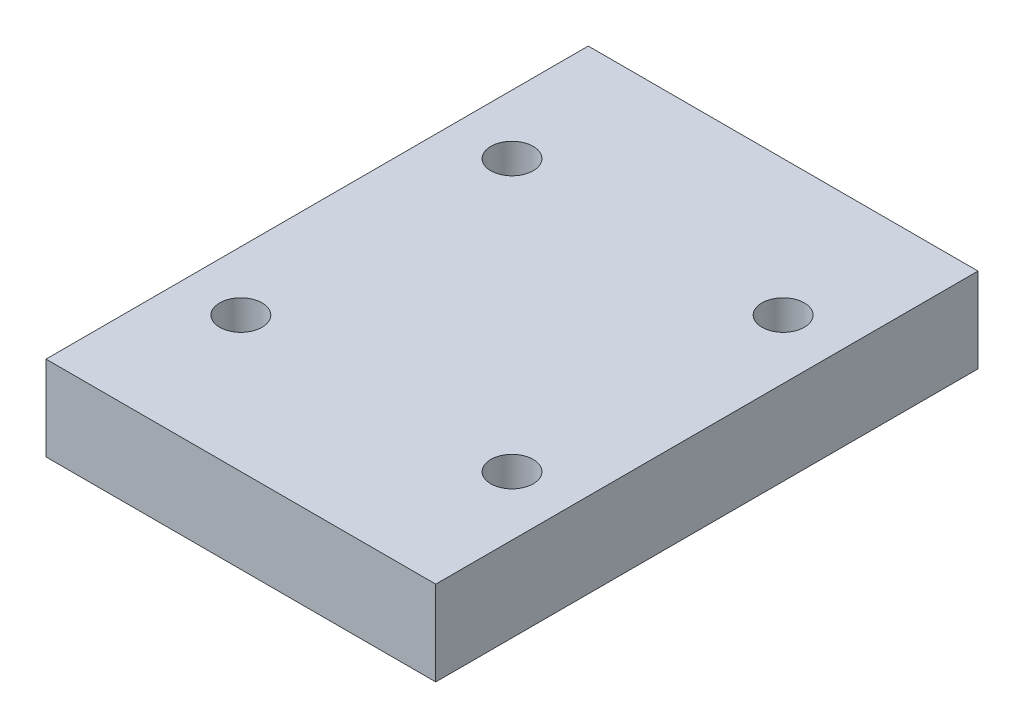
ISO-10303-21;
HEADER;
FILE_DESCRIPTION(('STEP AP214'),'2;1');
FILE_NAME('part.step','',(''),(''),'','','');
FILE_SCHEMA(('AUTOMOTIVE_DESIGN { 1 0 10303 214 1 1 1 1 }'));
ENDSEC;
DATA;
#1=APPLICATION_CONTEXT('core data for automotive mechanical design processes');
#2=APPLICATION_PROTOCOL_DEFINITION('international standard','automotive_design',2000,#1);
#3=PRODUCT_CONTEXT('',#1,'mechanical');
#4=PRODUCT('Part','Part','',(#3));
#5=PRODUCT_RELATED_PRODUCT_CATEGORY('part','',(#4));
#6=PRODUCT_DEFINITION_FORMATION('','',#4);
#7=PRODUCT_DEFINITION_CONTEXT('part definition',#1,'design');
#8=PRODUCT_DEFINITION('design','',#6,#7);
#9=PRODUCT_DEFINITION_SHAPE('','',#8);
#10=(LENGTH_UNIT() NAMED_UNIT(*) SI_UNIT(.MILLI.,.METRE.));
#11=(NAMED_UNIT(*) PLANE_ANGLE_UNIT() SI_UNIT($,.RADIAN.));
#12=(NAMED_UNIT(*) SI_UNIT($,.STERADIAN.) SOLID_ANGLE_UNIT());
#13=UNCERTAINTY_MEASURE_WITH_UNIT(LENGTH_MEASURE(1.E-05),#10,'distance_accuracy_value','');
#14=(GEOMETRIC_REPRESENTATION_CONTEXT(3) GLOBAL_UNCERTAINTY_ASSIGNED_CONTEXT((#13)) GLOBAL_UNIT_ASSIGNED_CONTEXT((#10,
#11,#12)) REPRESENTATION_CONTEXT('',''));
#15=CARTESIAN_POINT('',(0.,0.,0.));
#16=DIRECTION('',(0.,0.,1.));
#17=DIRECTION('',(1.,0.,0.));
#18=AXIS2_PLACEMENT_3D('',#15,#16,#17);
#19=CARTESIAN_POINT('',(0.,5.,0.));
#20=DIRECTION('',(0.,-1.,0.));
#21=DIRECTION('',(0.,0.,-1.));
#22=AXIS2_PLACEMENT_3D('',#19,#20,#21);
#23=PLANE('',#22);
#24=DIRECTION('',(0.,0.,1.));
#25=VECTOR('',#24,1.);
#26=CARTESIAN_POINT('',(-11.5,5.,-16.));
#27=LINE('',#26,#25);
#28=CARTESIAN_POINT('',(-11.5,5.,-16.));
#29=VERTEX_POINT('',#28);
#30=CARTESIAN_POINT('',(-11.5,5.,16.));
#31=VERTEX_POINT('',#30);
#32=EDGE_CURVE('E88',#29,#31,#27,.T.);
#33=ORIENTED_EDGE('',*,*,#32,.T.);
#34=DIRECTION('',(1.,0.,0.));
#35=VECTOR('',#34,1.);
#36=CARTESIAN_POINT('',(11.5,5.,16.));
#37=LINE('',#36,#35);
#38=CARTESIAN_POINT('',(11.5,5.,16.));
#39=VERTEX_POINT('',#38);
#40=EDGE_CURVE('E83',#31,#39,#37,.T.);
#41=ORIENTED_EDGE('',*,*,#40,.T.);
#42=DIRECTION('',(0.,0.,-1.));
#43=VECTOR('',#42,1.);
#44=CARTESIAN_POINT('',(11.5,5.,-16.));
#45=LINE('',#44,#43);
#46=CARTESIAN_POINT('',(11.5,5.,-16.));
#47=VERTEX_POINT('',#46);
#48=EDGE_CURVE('E86',#39,#47,#45,.T.);
#49=ORIENTED_EDGE('',*,*,#48,.T.);
#50=DIRECTION('',(-1.,0.,0.));
#51=VECTOR('',#50,1.);
#52=CARTESIAN_POINT('',(11.5,5.,-16.));
#53=LINE('',#52,#51);
#54=EDGE_CURVE('E53',#47,#29,#53,.T.);
#55=ORIENTED_EDGE('',*,*,#54,.T.);
#56=EDGE_LOOP('',(#33,#41,#49,#55));
#57=FACE_BOUND('',#56,.T.);
#58=CARTESIAN_POINT('',(-8.,5.,8.));
#59=DIRECTION('',(0.,1.,0.));
#60=DIRECTION('',(0.,0.,1.));
#61=AXIS2_PLACEMENT_3D('',#58,#59,#60);
#62=CIRCLE('',#61,1.25);
#63=CARTESIAN_POINT('',(-8.,5.,9.25));
#64=VERTEX_POINT('',#63);
#65=EDGE_CURVE('E103',#64,#64,#62,.T.);
#66=ORIENTED_EDGE('',*,*,#65,.F.);
#67=EDGE_LOOP('',(#66));
#68=FACE_BOUND('',#67,.T.);
#69=CARTESIAN_POINT('',(-8.,5.,-8.));
#70=DIRECTION('',(0.,1.,0.));
#71=DIRECTION('',(0.,0.,-1.));
#72=AXIS2_PLACEMENT_3D('',#69,#70,#71);
#73=CIRCLE('',#72,1.25);
#74=CARTESIAN_POINT('',(-8.,5.,-9.25));
#75=VERTEX_POINT('',#74);
#76=EDGE_CURVE('E118',#75,#75,#73,.T.);
#77=ORIENTED_EDGE('',*,*,#76,.F.);
#78=EDGE_LOOP('',(#77));
#79=FACE_BOUND('',#78,.T.);
#80=CARTESIAN_POINT('',(7.99999999999999,5.,-8.));
#81=DIRECTION('',(0.,1.,0.));
#82=DIRECTION('',(0.,0.,1.));
#83=AXIS2_PLACEMENT_3D('',#80,#81,#82);
#84=CIRCLE('',#83,1.25);
#85=CARTESIAN_POINT('',(7.99999999999999,5.,-6.75));
#86=VERTEX_POINT('',#85);
#87=EDGE_CURVE('E124',#86,#86,#84,.T.);
#88=ORIENTED_EDGE('',*,*,#87,.F.);
#89=EDGE_LOOP('',(#88));
#90=FACE_BOUND('',#89,.T.);
#91=CARTESIAN_POINT('',(8.,5.,8.));
#92=DIRECTION('',(0.,1.,0.));
#93=DIRECTION('',(0.,0.,-1.));
#94=AXIS2_PLACEMENT_3D('',#91,#92,#93);
#95=CIRCLE('',#94,1.25);
#96=CARTESIAN_POINT('',(8.,5.,6.75));
#97=VERTEX_POINT('',#96);
#98=EDGE_CURVE('E130',#97,#97,#95,.T.);
#99=ORIENTED_EDGE('',*,*,#98,.F.);
#100=EDGE_LOOP('',(#99));
#101=FACE_BOUND('',#100,.T.);
#102=ADVANCED_FACE('F36',(#57,#68,#79,#90,#101),#23,.F.);
#103=CARTESIAN_POINT('',(0.,0.,0.));
#104=DIRECTION('',(0.,-1.,0.));
#105=DIRECTION('',(0.,0.,-1.));
#106=AXIS2_PLACEMENT_3D('',#103,#104,#105);
#107=PLANE('',#106);
#108=CARTESIAN_POINT('',(7.99999999999999,0.,-8.));
#109=DIRECTION('',(0.,1.,0.));
#110=DIRECTION('',(0.,0.,1.));
#111=AXIS2_PLACEMENT_3D('',#108,#109,#110);
#112=CIRCLE('',#111,1.25);
#113=CARTESIAN_POINT('',(7.99999999999999,0.,-6.75));
#114=VERTEX_POINT('',#113);
#115=EDGE_CURVE('E127',#114,#114,#112,.T.);
#116=ORIENTED_EDGE('',*,*,#115,.T.);
#117=EDGE_LOOP('',(#116));
#118=FACE_BOUND('',#117,.T.);
#119=CARTESIAN_POINT('',(-8.,0.,8.));
#120=DIRECTION('',(0.,1.,0.));
#121=DIRECTION('',(0.,0.,1.));
#122=AXIS2_PLACEMENT_3D('',#119,#120,#121);
#123=CIRCLE('',#122,1.25);
#124=CARTESIAN_POINT('',(-8.,0.,9.25));
#125=VERTEX_POINT('',#124);
#126=EDGE_CURVE('E115',#125,#125,#123,.T.);
#127=ORIENTED_EDGE('',*,*,#126,.T.);
#128=EDGE_LOOP('',(#127));
#129=FACE_BOUND('',#128,.T.);
#130=DIRECTION('',(0.,0.,1.));
#131=VECTOR('',#130,1.);
#132=CARTESIAN_POINT('',(-11.5,0.,-16.));
#133=LINE('',#132,#131);
#134=CARTESIAN_POINT('',(-11.5,0.,-16.));
#135=VERTEX_POINT('',#134);
#136=CARTESIAN_POINT('',(-11.5,0.,16.));
#137=VERTEX_POINT('',#136);
#138=EDGE_CURVE('E100',#135,#137,#133,.T.);
#139=ORIENTED_EDGE('',*,*,#138,.F.);
#140=DIRECTION('',(-1.,0.,0.));
#141=VECTOR('',#140,1.);
#142=CARTESIAN_POINT('',(11.5,0.,-16.));
#143=LINE('',#142,#141);
#144=CARTESIAN_POINT('',(11.5,0.,-16.));
#145=VERTEX_POINT('',#144);
#146=EDGE_CURVE('E76',#145,#135,#143,.T.);
#147=ORIENTED_EDGE('',*,*,#146,.F.);
#148=DIRECTION('',(0.,0.,-1.));
#149=VECTOR('',#148,1.);
#150=CARTESIAN_POINT('',(11.5,0.,-16.));
#151=LINE('',#150,#149);
#152=CARTESIAN_POINT('',(11.5,0.,16.));
#153=VERTEX_POINT('',#152);
#154=EDGE_CURVE('E70',#153,#145,#151,.T.);
#155=ORIENTED_EDGE('',*,*,#154,.F.);
#156=DIRECTION('',(1.,0.,0.));
#157=VECTOR('',#156,1.);
#158=CARTESIAN_POINT('',(11.5,0.,16.));
#159=LINE('',#158,#157);
#160=EDGE_CURVE('E92',#137,#153,#159,.T.);
#161=ORIENTED_EDGE('',*,*,#160,.F.);
#162=EDGE_LOOP('',(#139,#147,#155,#161));
#163=FACE_BOUND('',#162,.T.);
#164=CARTESIAN_POINT('',(-8.,0.,-8.));
#165=DIRECTION('',(0.,1.,0.));
#166=DIRECTION('',(0.,0.,-1.));
#167=AXIS2_PLACEMENT_3D('',#164,#165,#166);
#168=CIRCLE('',#167,1.25);
#169=CARTESIAN_POINT('',(-8.,0.,-9.25));
#170=VERTEX_POINT('',#169);
#171=EDGE_CURVE('E121',#170,#170,#168,.T.);
#172=ORIENTED_EDGE('',*,*,#171,.T.);
#173=EDGE_LOOP('',(#172));
#174=FACE_BOUND('',#173,.T.);
#175=CARTESIAN_POINT('',(8.,0.,8.));
#176=DIRECTION('',(0.,1.,0.));
#177=DIRECTION('',(0.,0.,-1.));
#178=AXIS2_PLACEMENT_3D('',#175,#176,#177);
#179=CIRCLE('',#178,1.25);
#180=CARTESIAN_POINT('',(8.,0.,6.75));
#181=VERTEX_POINT('',#180);
#182=EDGE_CURVE('E133',#181,#181,#179,.T.);
#183=ORIENTED_EDGE('',*,*,#182,.T.);
#184=EDGE_LOOP('',(#183));
#185=FACE_BOUND('',#184,.T.);
#186=ADVANCED_FACE('F111',(#118,#129,#163,#174,#185),#107,.T.);
#187=CARTESIAN_POINT('',(-11.5,5.,-16.));
#188=DIRECTION('',(1.,0.,0.));
#189=DIRECTION('',(0.,0.,-1.));
#190=AXIS2_PLACEMENT_3D('',#187,#188,#189);
#191=PLANE('',#190);
#192=ORIENTED_EDGE('',*,*,#138,.T.);
#193=DIRECTION('',(0.,-1.,0.));
#194=VECTOR('',#193,1.);
#195=CARTESIAN_POINT('',(-11.5,5.,16.));
#196=LINE('',#195,#194);
#197=EDGE_CURVE('E11',#31,#137,#196,.T.);
#198=ORIENTED_EDGE('',*,*,#197,.F.);
#199=ORIENTED_EDGE('',*,*,#32,.F.);
#200=DIRECTION('',(0.,-1.,0.));
#201=VECTOR('',#200,1.);
#202=CARTESIAN_POINT('',(-11.5,5.,-16.));
#203=LINE('',#202,#201);
#204=EDGE_CURVE('E96',#29,#135,#203,.T.);
#205=ORIENTED_EDGE('',*,*,#204,.T.);
#206=EDGE_LOOP('',(#192,#198,#199,#205));
#207=FACE_BOUND('',#206,.T.);
#208=ADVANCED_FACE('F38',(#207),#191,.F.);
#209=CARTESIAN_POINT('',(11.5,5.,16.));
#210=DIRECTION('',(0.,0.,-1.));
#211=DIRECTION('',(-1.,0.,0.));
#212=AXIS2_PLACEMENT_3D('',#209,#210,#211);
#213=PLANE('',#212);
#214=ORIENTED_EDGE('',*,*,#160,.T.);
#215=DIRECTION('',(0.,-1.,0.));
#216=VECTOR('',#215,1.);
#217=CARTESIAN_POINT('',(11.5,5.,16.));
#218=LINE('',#217,#216);
#219=EDGE_CURVE('E45',#39,#153,#218,.T.);
#220=ORIENTED_EDGE('',*,*,#219,.F.);
#221=ORIENTED_EDGE('',*,*,#40,.F.);
#222=ORIENTED_EDGE('',*,*,#197,.T.);
#223=EDGE_LOOP('',(#214,#220,#221,#222));
#224=FACE_BOUND('',#223,.T.);
#225=ADVANCED_FACE('F91',(#224),#213,.F.);
#226=CARTESIAN_POINT('',(11.5,5.,-16.));
#227=DIRECTION('',(-1.,0.,0.));
#228=DIRECTION('',(0.,0.,1.));
#229=AXIS2_PLACEMENT_3D('',#226,#227,#228);
#230=PLANE('',#229);
#231=ORIENTED_EDGE('',*,*,#154,.T.);
#232=DIRECTION('',(0.,-1.,0.));
#233=VECTOR('',#232,1.);
#234=CARTESIAN_POINT('',(11.5,5.,-16.));
#235=LINE('',#234,#233);
#236=EDGE_CURVE('E93',#47,#145,#235,.T.);
#237=ORIENTED_EDGE('',*,*,#236,.F.);
#238=ORIENTED_EDGE('',*,*,#48,.F.);
#239=ORIENTED_EDGE('',*,*,#219,.T.);
#240=EDGE_LOOP('',(#231,#237,#238,#239));
#241=FACE_BOUND('',#240,.T.);
#242=ADVANCED_FACE('F94',(#241),#230,.F.);
#243=CARTESIAN_POINT('',(11.5,5.,-16.));
#244=DIRECTION('',(0.,0.,1.));
#245=DIRECTION('',(1.,0.,0.));
#246=AXIS2_PLACEMENT_3D('',#243,#244,#245);
#247=PLANE('',#246);
#248=ORIENTED_EDGE('',*,*,#146,.T.);
#249=ORIENTED_EDGE('',*,*,#204,.F.);
#250=ORIENTED_EDGE('',*,*,#54,.F.);
#251=ORIENTED_EDGE('',*,*,#236,.T.);
#252=EDGE_LOOP('',(#248,#249,#250,#251));
#253=FACE_BOUND('',#252,.T.);
#254=ADVANCED_FACE('F108',(#253),#247,.F.);
#255=CARTESIAN_POINT('',(-8.,5.,8.));
#256=DIRECTION('',(0.,-1.,0.));
#257=DIRECTION('',(0.,0.,-1.));
#258=AXIS2_PLACEMENT_3D('',#255,#256,#257);
#259=CYLINDRICAL_SURFACE('',#258,1.25);
#260=ORIENTED_EDGE('',*,*,#65,.T.);
#261=EDGE_LOOP('',(#260));
#262=FACE_BOUND('',#261,.T.);
#263=ORIENTED_EDGE('',*,*,#126,.F.);
#264=EDGE_LOOP('',(#263));
#265=FACE_BOUND('',#264,.T.);
#266=ADVANCED_FACE('F150',(#262,#265),#259,.F.);
#267=CARTESIAN_POINT('',(-8.,5.,-8.));
#268=DIRECTION('',(0.,-1.,0.));
#269=DIRECTION('',(0.,0.,-1.));
#270=AXIS2_PLACEMENT_3D('',#267,#268,#269);
#271=CYLINDRICAL_SURFACE('',#270,1.25);
#272=ORIENTED_EDGE('',*,*,#76,.T.);
#273=EDGE_LOOP('',(#272));
#274=FACE_BOUND('',#273,.T.);
#275=ORIENTED_EDGE('',*,*,#171,.F.);
#276=EDGE_LOOP('',(#275));
#277=FACE_BOUND('',#276,.T.);
#278=ADVANCED_FACE('F196',(#274,#277),#271,.F.);
#279=CARTESIAN_POINT('',(7.99999999999999,5.,-8.));
#280=DIRECTION('',(0.,-1.,0.));
#281=DIRECTION('',(0.,0.,-1.));
#282=AXIS2_PLACEMENT_3D('',#279,#280,#281);
#283=CYLINDRICAL_SURFACE('',#282,1.25);
#284=ORIENTED_EDGE('',*,*,#87,.T.);
#285=EDGE_LOOP('',(#284));
#286=FACE_BOUND('',#285,.T.);
#287=ORIENTED_EDGE('',*,*,#115,.F.);
#288=EDGE_LOOP('',(#287));
#289=FACE_BOUND('',#288,.T.);
#290=ADVANCED_FACE('F204',(#286,#289),#283,.F.);
#291=CARTESIAN_POINT('',(8.,5.,8.));
#292=DIRECTION('',(0.,-1.,0.));
#293=DIRECTION('',(0.,0.,-1.));
#294=AXIS2_PLACEMENT_3D('',#291,#292,#293);
#295=CYLINDRICAL_SURFACE('',#294,1.25);
#296=ORIENTED_EDGE('',*,*,#98,.T.);
#297=EDGE_LOOP('',(#296));
#298=FACE_BOUND('',#297,.T.);
#299=ORIENTED_EDGE('',*,*,#182,.F.);
#300=EDGE_LOOP('',(#299));
#301=FACE_BOUND('',#300,.T.);
#302=ADVANCED_FACE('F139',(#298,#301),#295,.F.);
#303=CLOSED_SHELL('',(#102,#186,#208,#225,#242,#254,#266,#278,#290,#302));
#304=MANIFOLD_SOLID_BREP('B2',#303);
#305=ADVANCED_BREP_SHAPE_REPRESENTATION('',(#18,#304),#14);
#306=SHAPE_DEFINITION_REPRESENTATION(#9,#305);
ENDSEC;
END-ISO-10303-21;
